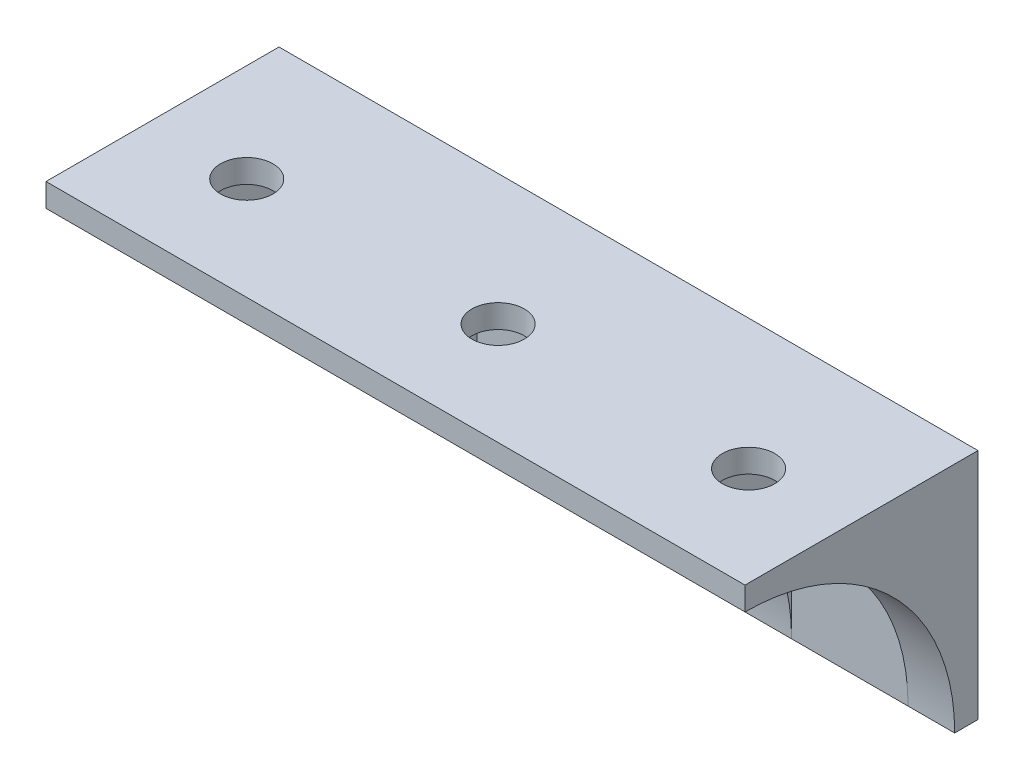
ISO-10303-21;
HEADER;
FILE_DESCRIPTION(('STEP AP214'),'2;1');
FILE_NAME('part.step','',(''),(''),'','','');
FILE_SCHEMA(('AUTOMOTIVE_DESIGN { 1 0 10303 214 1 1 1 1 }'));
ENDSEC;
DATA;
#1=APPLICATION_CONTEXT('core data for automotive mechanical design processes');
#2=APPLICATION_PROTOCOL_DEFINITION('international standard','automotive_design',2000,#1);
#3=PRODUCT_CONTEXT('',#1,'mechanical');
#4=PRODUCT('Part','Part','',(#3));
#5=PRODUCT_RELATED_PRODUCT_CATEGORY('part','',(#4));
#6=PRODUCT_DEFINITION_FORMATION('','',#4);
#7=PRODUCT_DEFINITION_CONTEXT('part definition',#1,'design');
#8=PRODUCT_DEFINITION('design','',#6,#7);
#9=PRODUCT_DEFINITION_SHAPE('','',#8);
#10=(LENGTH_UNIT() NAMED_UNIT(*) SI_UNIT(.MILLI.,.METRE.));
#11=(NAMED_UNIT(*) PLANE_ANGLE_UNIT() SI_UNIT($,.RADIAN.));
#12=(NAMED_UNIT(*) SI_UNIT($,.STERADIAN.) SOLID_ANGLE_UNIT());
#13=UNCERTAINTY_MEASURE_WITH_UNIT(LENGTH_MEASURE(1.E-05),#10,'distance_accuracy_value','');
#14=(GEOMETRIC_REPRESENTATION_CONTEXT(3) GLOBAL_UNCERTAINTY_ASSIGNED_CONTEXT((#13)) GLOBAL_UNIT_ASSIGNED_CONTEXT((#10,
#11,#12)) REPRESENTATION_CONTEXT('',''));
#15=CARTESIAN_POINT('',(0.,0.,0.));
#16=DIRECTION('',(0.,0.,1.));
#17=DIRECTION('',(1.,0.,0.));
#18=AXIS2_PLACEMENT_3D('',#15,#16,#17);
#19=CARTESIAN_POINT('',(-30.,-10.,20.));
#20=DIRECTION('',(1.,0.,0.));
#21=DIRECTION('',(0.,1.,0.));
#22=AXIS2_PLACEMENT_3D('',#19,#20,#21);
#23=CYLINDRICAL_SURFACE('',#22,18.);
#24=DIRECTION('',(1.,0.,0.));
#25=VECTOR('',#24,1.);
#26=CARTESIAN_POINT('',(-30.,-10.,2.));
#27=LINE('',#26,#25);
#28=CARTESIAN_POINT('',(-30.,-10.,2.));
#29=VERTEX_POINT('',#28);
#30=CARTESIAN_POINT('',(-26.,-10.,2.));
#31=VERTEX_POINT('',#30);
#32=EDGE_CURVE('E172',#29,#31,#27,.T.);
#33=ORIENTED_EDGE('',*,*,#32,.T.);
#34=CARTESIAN_POINT('',(-26.,-10.,20.));
#35=DIRECTION('',(-1.,0.,0.));
#36=DIRECTION('',(0.,-1.,0.));
#37=AXIS2_PLACEMENT_3D('',#34,#35,#36);
#38=CIRCLE('',#37,18.);
#39=CARTESIAN_POINT('',(-26.,8.,20.));
#40=VERTEX_POINT('',#39);
#41=EDGE_CURVE('E11',#31,#40,#38,.F.);
#42=ORIENTED_EDGE('',*,*,#41,.T.);
#43=DIRECTION('',(1.,0.,0.));
#44=VECTOR('',#43,1.);
#45=CARTESIAN_POINT('',(-30.,8.,20.));
#46=LINE('',#45,#44);
#47=CARTESIAN_POINT('',(-30.,8.,20.));
#48=VERTEX_POINT('',#47);
#49=EDGE_CURVE('E317',#48,#40,#46,.T.);
#50=ORIENTED_EDGE('',*,*,#49,.F.);
#51=CARTESIAN_POINT('',(-30.,-10.,20.));
#52=DIRECTION('',(1.,0.,0.));
#53=DIRECTION('',(0.,0.,-1.));
#54=AXIS2_PLACEMENT_3D('',#51,#52,#53);
#55=CIRCLE('',#54,18.);
#56=EDGE_CURVE('E180',#29,#48,#55,.T.);
#57=ORIENTED_EDGE('',*,*,#56,.F.);
#58=EDGE_LOOP('',(#33,#42,#50,#57));
#59=FACE_BOUND('',#58,.T.);
#60=ADVANCED_FACE('F42',(#59),#23,.F.);
#61=CARTESIAN_POINT('',(-16.,8.,20.));
#62=VERTEX_POINT('',#61);
#63=CARTESIAN_POINT('',(-11.,8.,20.));
#64=VERTEX_POINT('',#63);
#65=EDGE_CURVE('E247',#62,#64,#46,.T.);
#66=ORIENTED_EDGE('',*,*,#65,.F.);
#67=CARTESIAN_POINT('',(-16.,-10.,20.));
#68=DIRECTION('',(1.,0.,0.));
#69=DIRECTION('',(0.,0.,-1.));
#70=AXIS2_PLACEMENT_3D('',#67,#68,#69);
#71=CIRCLE('',#70,18.);
#72=CARTESIAN_POINT('',(-16.,-10.,2.));
#73=VERTEX_POINT('',#72);
#74=EDGE_CURVE('E51',#62,#73,#71,.F.);
#75=ORIENTED_EDGE('',*,*,#74,.T.);
#76=CARTESIAN_POINT('',(-11.,-10.,2.));
#77=VERTEX_POINT('',#76);
#78=EDGE_CURVE('E176',#73,#77,#27,.T.);
#79=ORIENTED_EDGE('',*,*,#78,.T.);
#80=CARTESIAN_POINT('',(-11.,-10.,20.));
#81=DIRECTION('',(-1.,0.,0.));
#82=DIRECTION('',(0.,-1.,0.));
#83=AXIS2_PLACEMENT_3D('',#80,#81,#82);
#84=CIRCLE('',#83,18.);
#85=EDGE_CURVE('E238',#77,#64,#84,.F.);
#86=ORIENTED_EDGE('',*,*,#85,.T.);
#87=EDGE_LOOP('',(#66,#75,#79,#86));
#88=FACE_BOUND('',#87,.T.);
#89=ADVANCED_FACE('F245',(#88),#23,.F.);
#90=CARTESIAN_POINT('',(11.,8.,20.));
#91=VERTEX_POINT('',#90);
#92=CARTESIAN_POINT('',(16.,8.,20.));
#93=VERTEX_POINT('',#92);
#94=EDGE_CURVE('E373',#91,#93,#46,.T.);
#95=ORIENTED_EDGE('',*,*,#94,.F.);
#96=CARTESIAN_POINT('',(11.,-10.,20.));
#97=DIRECTION('',(1.,0.,0.));
#98=DIRECTION('',(0.,1.,0.));
#99=AXIS2_PLACEMENT_3D('',#96,#97,#98);
#100=CIRCLE('',#99,18.);
#101=CARTESIAN_POINT('',(11.,-10.,2.));
#102=VERTEX_POINT('',#101);
#103=EDGE_CURVE('E234',#91,#102,#100,.F.);
#104=ORIENTED_EDGE('',*,*,#103,.T.);
#105=CARTESIAN_POINT('',(16.,-10.,2.));
#106=VERTEX_POINT('',#105);
#107=EDGE_CURVE('E190',#102,#106,#27,.T.);
#108=ORIENTED_EDGE('',*,*,#107,.T.);
#109=CARTESIAN_POINT('',(16.,-10.,20.));
#110=DIRECTION('',(-1.,0.,0.));
#111=DIRECTION('',(0.,0.,1.));
#112=AXIS2_PLACEMENT_3D('',#109,#110,#111);
#113=CIRCLE('',#112,18.);
#114=EDGE_CURVE('E230',#106,#93,#113,.F.);
#115=ORIENTED_EDGE('',*,*,#114,.T.);
#116=EDGE_LOOP('',(#95,#104,#108,#115));
#117=FACE_BOUND('',#116,.T.);
#118=ADVANCED_FACE('F355',(#117),#23,.F.);
#119=CARTESIAN_POINT('',(30.,10.,2.));
#120=DIRECTION('',(-1.,0.,0.));
#121=DIRECTION('',(0.,-1.,0.));
#122=AXIS2_PLACEMENT_3D('',#119,#120,#121);
#123=PLANE('',#122);
#124=DIRECTION('',(0.,1.,0.));
#125=VECTOR('',#124,1.);
#126=CARTESIAN_POINT('',(30.,10.,0.));
#127=LINE('',#126,#125);
#128=CARTESIAN_POINT('',(30.,-10.,0.));
#129=VERTEX_POINT('',#128);
#130=CARTESIAN_POINT('',(30.,10.,0.));
#131=VERTEX_POINT('',#130);
#132=EDGE_CURVE('E326',#129,#131,#127,.T.);
#133=ORIENTED_EDGE('',*,*,#132,.T.);
#134=DIRECTION('',(0.,0.,-1.));
#135=VECTOR('',#134,1.);
#136=CARTESIAN_POINT('',(30.,10.,2.));
#137=LINE('',#136,#135);
#138=CARTESIAN_POINT('',(30.,10.,20.));
#139=VERTEX_POINT('',#138);
#140=EDGE_CURVE('E218',#139,#131,#137,.T.);
#141=ORIENTED_EDGE('',*,*,#140,.F.);
#142=DIRECTION('',(0.,1.,0.));
#143=VECTOR('',#142,1.);
#144=CARTESIAN_POINT('',(30.,10.,20.));
#145=LINE('',#144,#143);
#146=CARTESIAN_POINT('',(30.,8.,20.));
#147=VERTEX_POINT('',#146);
#148=EDGE_CURVE('E320',#147,#139,#145,.T.);
#149=ORIENTED_EDGE('',*,*,#148,.F.);
#150=CARTESIAN_POINT('',(30.,-10.,20.));
#151=DIRECTION('',(-1.,0.,0.));
#152=DIRECTION('',(0.,-1.,0.));
#153=AXIS2_PLACEMENT_3D('',#150,#151,#152);
#154=CIRCLE('',#153,18.);
#155=CARTESIAN_POINT('',(30.,-10.,2.));
#156=VERTEX_POINT('',#155);
#157=EDGE_CURVE('E222',#147,#156,#154,.T.);
#158=ORIENTED_EDGE('',*,*,#157,.T.);
#159=DIRECTION('',(0.,0.,-1.));
#160=VECTOR('',#159,1.);
#161=CARTESIAN_POINT('',(30.,-10.,2.));
#162=LINE('',#161,#160);
#163=EDGE_CURVE('E182',#156,#129,#162,.T.);
#164=ORIENTED_EDGE('',*,*,#163,.T.);
#165=EDGE_LOOP('',(#133,#141,#149,#158,#164));
#166=FACE_BOUND('',#165,.T.);
#167=ADVANCED_FACE('F366',(#166),#123,.F.);
#168=CARTESIAN_POINT('',(-30.,10.,2.));
#169=DIRECTION('',(0.,-1.,0.));
#170=DIRECTION('',(0.,0.,-1.));
#171=AXIS2_PLACEMENT_3D('',#168,#169,#170);
#172=PLANE('',#171);
#173=CARTESIAN_POINT('',(21.4986885576466,10.,11.1912741614558));
#174=DIRECTION('',(0.,-1.,0.));
#175=DIRECTION('',(0.,0.,-1.));
#176=AXIS2_PLACEMENT_3D('',#173,#174,#175);
#177=CIRCLE('',#176,2.25);
#178=CARTESIAN_POINT('',(21.4986885576466,10.,8.9412741614558));
#179=VERTEX_POINT('',#178);
#180=EDGE_CURVE('E450',#179,#179,#177,.T.);
#181=ORIENTED_EDGE('',*,*,#180,.T.);
#182=EDGE_LOOP('',(#181));
#183=FACE_BOUND('',#182,.T.);
#184=CARTESIAN_POINT('',(-21.5793316978392,10.,11.1912741614558));
#185=DIRECTION('',(0.,-1.,0.));
#186=DIRECTION('',(0.,0.,-1.));
#187=AXIS2_PLACEMENT_3D('',#184,#185,#186);
#188=CIRCLE('',#187,2.25);
#189=CARTESIAN_POINT('',(-21.5793316978392,10.,8.9412741614558));
#190=VERTEX_POINT('',#189);
#191=EDGE_CURVE('E463',#190,#190,#188,.T.);
#192=ORIENTED_EDGE('',*,*,#191,.T.);
#193=EDGE_LOOP('',(#192));
#194=FACE_BOUND('',#193,.T.);
#195=CARTESIAN_POINT('',(0.,10.,11.1912741614558));
#196=DIRECTION('',(0.,-1.,0.));
#197=DIRECTION('',(0.,0.,-1.));
#198=AXIS2_PLACEMENT_3D('',#195,#196,#197);
#199=CIRCLE('',#198,2.25);
#200=CARTESIAN_POINT('',(0.,10.,8.9412741614558));
#201=VERTEX_POINT('',#200);
#202=EDGE_CURVE('E295',#201,#201,#199,.T.);
#203=ORIENTED_EDGE('',*,*,#202,.T.);
#204=EDGE_LOOP('',(#203));
#205=FACE_BOUND('',#204,.T.);
#206=DIRECTION('',(-1.,0.,0.));
#207=VECTOR('',#206,1.);
#208=CARTESIAN_POINT('',(-30.,10.,0.));
#209=LINE('',#208,#207);
#210=CARTESIAN_POINT('',(-30.,10.,0.));
#211=VERTEX_POINT('',#210);
#212=EDGE_CURVE('E208',#131,#211,#209,.T.);
#213=ORIENTED_EDGE('',*,*,#212,.T.);
#214=DIRECTION('',(0.,0.,-1.));
#215=VECTOR('',#214,1.);
#216=CARTESIAN_POINT('',(-30.,10.,2.));
#217=LINE('',#216,#215);
#218=CARTESIAN_POINT('',(-30.,10.,20.));
#219=VERTEX_POINT('',#218);
#220=EDGE_CURVE('E214',#219,#211,#217,.T.);
#221=ORIENTED_EDGE('',*,*,#220,.F.);
#222=DIRECTION('',(-1.,0.,0.));
#223=VECTOR('',#222,1.);
#224=CARTESIAN_POINT('',(-30.,10.,20.));
#225=LINE('',#224,#223);
#226=EDGE_CURVE('E323',#139,#219,#225,.T.);
#227=ORIENTED_EDGE('',*,*,#226,.F.);
#228=ORIENTED_EDGE('',*,*,#140,.T.);
#229=EDGE_LOOP('',(#213,#221,#227,#228));
#230=FACE_BOUND('',#229,.T.);
#231=ADVANCED_FACE('F336',(#183,#194,#205,#230),#172,.F.);
#232=CARTESIAN_POINT('',(-30.,10.,2.));
#233=DIRECTION('',(1.,0.,0.));
#234=DIRECTION('',(0.,0.,-1.));
#235=AXIS2_PLACEMENT_3D('',#232,#233,#234);
#236=PLANE('',#235);
#237=DIRECTION('',(0.,-1.,0.));
#238=VECTOR('',#237,1.);
#239=CARTESIAN_POINT('',(-30.,10.,0.));
#240=LINE('',#239,#238);
#241=CARTESIAN_POINT('',(-30.,-10.,0.));
#242=VERTEX_POINT('',#241);
#243=EDGE_CURVE('E203',#211,#242,#240,.T.);
#244=ORIENTED_EDGE('',*,*,#243,.T.);
#245=DIRECTION('',(0.,0.,-1.));
#246=VECTOR('',#245,1.);
#247=CARTESIAN_POINT('',(-30.,-10.,2.));
#248=LINE('',#247,#246);
#249=EDGE_CURVE('E188',#29,#242,#248,.T.);
#250=ORIENTED_EDGE('',*,*,#249,.F.);
#251=ORIENTED_EDGE('',*,*,#56,.T.);
#252=DIRECTION('',(0.,-1.,0.));
#253=VECTOR('',#252,1.);
#254=CARTESIAN_POINT('',(-30.,10.,20.));
#255=LINE('',#254,#253);
#256=EDGE_CURVE('E262',#219,#48,#255,.T.);
#257=ORIENTED_EDGE('',*,*,#256,.F.);
#258=ORIENTED_EDGE('',*,*,#220,.T.);
#259=EDGE_LOOP('',(#244,#250,#251,#257,#258));
#260=FACE_BOUND('',#259,.T.);
#261=ADVANCED_FACE('F340',(#260),#236,.F.);
#262=CARTESIAN_POINT('',(-30.,-10.,2.));
#263=DIRECTION('',(0.,1.,0.));
#264=DIRECTION('',(0.,0.,1.));
#265=AXIS2_PLACEMENT_3D('',#262,#263,#264);
#266=PLANE('',#265);
#267=DIRECTION('',(1.,0.,0.));
#268=VECTOR('',#267,1.);
#269=CARTESIAN_POINT('',(-30.,-10.,0.));
#270=LINE('',#269,#268);
#271=EDGE_CURVE('E194',#242,#129,#270,.T.);
#272=ORIENTED_EDGE('',*,*,#271,.T.);
#273=ORIENTED_EDGE('',*,*,#163,.F.);
#274=CARTESIAN_POINT('',(26.,-10.,2.));
#275=VERTEX_POINT('',#274);
#276=EDGE_CURVE('E184',#275,#156,#27,.T.);
#277=ORIENTED_EDGE('',*,*,#276,.F.);
#278=DIRECTION('',(1.,0.,0.));
#279=VECTOR('',#278,1.);
#280=CARTESIAN_POINT('',(16.,-10.,2.));
#281=LINE('',#280,#279);
#282=EDGE_CURVE('E306',#106,#275,#281,.T.);
#283=ORIENTED_EDGE('',*,*,#282,.F.);
#284=ORIENTED_EDGE('',*,*,#107,.F.);
#285=DIRECTION('',(1.,0.,0.));
#286=VECTOR('',#285,1.);
#287=CARTESIAN_POINT('',(-11.,-10.,2.));
#288=LINE('',#287,#286);
#289=EDGE_CURVE('E282',#77,#102,#288,.T.);
#290=ORIENTED_EDGE('',*,*,#289,.F.);
#291=ORIENTED_EDGE('',*,*,#78,.F.);
#292=DIRECTION('',(1.,0.,0.));
#293=VECTOR('',#292,1.);
#294=CARTESIAN_POINT('',(-26.,-10.,2.));
#295=LINE('',#294,#293);
#296=EDGE_CURVE('E160',#31,#73,#295,.T.);
#297=ORIENTED_EDGE('',*,*,#296,.F.);
#298=ORIENTED_EDGE('',*,*,#32,.F.);
#299=ORIENTED_EDGE('',*,*,#249,.T.);
#300=EDGE_LOOP('',(#272,#273,#277,#283,#284,#290,#291,#297,#298,#299));
#301=FACE_BOUND('',#300,.T.);
#302=ADVANCED_FACE('F170',(#301),#266,.F.);
#303=CARTESIAN_POINT('',(0.,0.,0.));
#304=DIRECTION('',(0.,0.,1.));
#305=DIRECTION('',(1.,0.,0.));
#306=AXIS2_PLACEMENT_3D('',#303,#304,#305);
#307=PLANE('',#306);
#308=ORIENTED_EDGE('',*,*,#132,.F.);
#309=ORIENTED_EDGE('',*,*,#271,.F.);
#310=ORIENTED_EDGE('',*,*,#243,.F.);
#311=ORIENTED_EDGE('',*,*,#212,.F.);
#312=EDGE_LOOP('',(#308,#309,#310,#311));
#313=FACE_BOUND('',#312,.T.);
#314=ADVANCED_FACE('F341',(#313),#307,.F.);
#315=CARTESIAN_POINT('',(0.,0.,20.));
#316=DIRECTION('',(0.,0.,1.));
#317=DIRECTION('',(1.,0.,0.));
#318=AXIS2_PLACEMENT_3D('',#315,#316,#317);
#319=PLANE('',#318);
#320=ORIENTED_EDGE('',*,*,#256,.T.);
#321=ORIENTED_EDGE('',*,*,#49,.T.);
#322=DIRECTION('',(-1.,0.,0.));
#323=VECTOR('',#322,1.);
#324=CARTESIAN_POINT('',(-26.,8.,20.));
#325=LINE('',#324,#323);
#326=EDGE_CURVE('E165',#62,#40,#325,.T.);
#327=ORIENTED_EDGE('',*,*,#326,.F.);
#328=ORIENTED_EDGE('',*,*,#65,.T.);
#329=DIRECTION('',(-1.,0.,0.));
#330=VECTOR('',#329,1.);
#331=CARTESIAN_POINT('',(-11.,8.,20.));
#332=LINE('',#331,#330);
#333=EDGE_CURVE('E259',#91,#64,#332,.T.);
#334=ORIENTED_EDGE('',*,*,#333,.F.);
#335=ORIENTED_EDGE('',*,*,#94,.T.);
#336=DIRECTION('',(-1.,0.,0.));
#337=VECTOR('',#336,1.);
#338=CARTESIAN_POINT('',(16.,8.,20.));
#339=LINE('',#338,#337);
#340=CARTESIAN_POINT('',(26.,8.,20.));
#341=VERTEX_POINT('',#340);
#342=EDGE_CURVE('E271',#341,#93,#339,.T.);
#343=ORIENTED_EDGE('',*,*,#342,.F.);
#344=EDGE_CURVE('E316',#341,#147,#46,.T.);
#345=ORIENTED_EDGE('',*,*,#344,.T.);
#346=ORIENTED_EDGE('',*,*,#148,.T.);
#347=ORIENTED_EDGE('',*,*,#226,.T.);
#348=EDGE_LOOP('',(#320,#321,#327,#328,#334,#335,#343,#345,#346,#347));
#349=FACE_BOUND('',#348,.T.);
#350=ADVANCED_FACE('F343',(#349),#319,.T.);
#351=ORIENTED_EDGE('',*,*,#344,.F.);
#352=CARTESIAN_POINT('',(26.,-10.,20.));
#353=DIRECTION('',(1.,0.,0.));
#354=DIRECTION('',(0.,1.,0.));
#355=AXIS2_PLACEMENT_3D('',#352,#353,#354);
#356=CIRCLE('',#355,18.);
#357=EDGE_CURVE('E227',#341,#275,#356,.F.);
#358=ORIENTED_EDGE('',*,*,#357,.T.);
#359=ORIENTED_EDGE('',*,*,#276,.T.);
#360=ORIENTED_EDGE('',*,*,#157,.F.);
#361=EDGE_LOOP('',(#351,#358,#359,#360));
#362=FACE_BOUND('',#361,.T.);
#363=ADVANCED_FACE('F44',(#362),#23,.F.);
#364=CARTESIAN_POINT('',(16.,8.,2.));
#365=DIRECTION('',(-1.,0.,0.));
#366=DIRECTION('',(0.,0.,1.));
#367=AXIS2_PLACEMENT_3D('',#364,#365,#366);
#368=PLANE('',#367);
#369=DIRECTION('',(0.,-1.,0.));
#370=VECTOR('',#369,1.);
#371=CARTESIAN_POINT('',(16.,8.,2.));
#372=LINE('',#371,#370);
#373=CARTESIAN_POINT('',(16.,8.,2.));
#374=VERTEX_POINT('',#373);
#375=EDGE_CURVE('E298',#374,#106,#372,.T.);
#376=ORIENTED_EDGE('',*,*,#375,.F.);
#377=DIRECTION('',(0.,0.,1.));
#378=VECTOR('',#377,1.);
#379=CARTESIAN_POINT('',(16.,8.,2.));
#380=LINE('',#379,#378);
#381=EDGE_CURVE('E292',#374,#93,#380,.T.);
#382=ORIENTED_EDGE('',*,*,#381,.T.);
#383=ORIENTED_EDGE('',*,*,#114,.F.);
#384=EDGE_LOOP('',(#376,#382,#383));
#385=FACE_BOUND('',#384,.T.);
#386=ADVANCED_FACE('F357',(#385),#368,.F.);
#387=CARTESIAN_POINT('',(26.,8.,2.));
#388=DIRECTION('',(1.,0.,0.));
#389=DIRECTION('',(0.,1.,0.));
#390=AXIS2_PLACEMENT_3D('',#387,#388,#389);
#391=PLANE('',#390);
#392=DIRECTION('',(0.,0.,1.));
#393=VECTOR('',#392,1.);
#394=CARTESIAN_POINT('',(26.,8.,2.));
#395=LINE('',#394,#393);
#396=CARTESIAN_POINT('',(26.,8.,2.));
#397=VERTEX_POINT('',#396);
#398=EDGE_CURVE('E58',#397,#341,#395,.T.);
#399=ORIENTED_EDGE('',*,*,#398,.F.);
#400=DIRECTION('',(0.,1.,0.));
#401=VECTOR('',#400,1.);
#402=CARTESIAN_POINT('',(26.,8.,2.));
#403=LINE('',#402,#401);
#404=EDGE_CURVE('E302',#275,#397,#403,.T.);
#405=ORIENTED_EDGE('',*,*,#404,.F.);
#406=ORIENTED_EDGE('',*,*,#357,.F.);
#407=EDGE_LOOP('',(#399,#405,#406));
#408=FACE_BOUND('',#407,.T.);
#409=ADVANCED_FACE('F361',(#408),#391,.F.);
#410=CARTESIAN_POINT('',(16.,8.,2.));
#411=DIRECTION('',(0.,1.,0.));
#412=DIRECTION('',(0.,0.,1.));
#413=AXIS2_PLACEMENT_3D('',#410,#411,#412);
#414=PLANE('',#413);
#415=CARTESIAN_POINT('',(21.4986885576466,7.99999999999999,11.1912741614558));
#416=DIRECTION('',(0.,-1.,0.));
#417=DIRECTION('',(0.,0.,-1.));
#418=AXIS2_PLACEMENT_3D('',#415,#416,#417);
#419=CIRCLE('',#418,2.24999999999999);
#420=CARTESIAN_POINT('',(21.4986885576466,7.99999999999999,8.94127416145581));
#421=VERTEX_POINT('',#420);
#422=EDGE_CURVE('E453',#421,#421,#419,.T.);
#423=ORIENTED_EDGE('',*,*,#422,.F.);
#424=EDGE_LOOP('',(#423));
#425=FACE_BOUND('',#424,.T.);
#426=ORIENTED_EDGE('',*,*,#342,.T.);
#427=ORIENTED_EDGE('',*,*,#381,.F.);
#428=DIRECTION('',(-1.,0.,0.));
#429=VECTOR('',#428,1.);
#430=CARTESIAN_POINT('',(16.,8.,2.));
#431=LINE('',#430,#429);
#432=EDGE_CURVE('E291',#397,#374,#431,.T.);
#433=ORIENTED_EDGE('',*,*,#432,.F.);
#434=ORIENTED_EDGE('',*,*,#398,.T.);
#435=EDGE_LOOP('',(#426,#427,#433,#434));
#436=FACE_BOUND('',#435,.T.);
#437=ADVANCED_FACE('F390',(#425,#436),#414,.F.);
#438=CARTESIAN_POINT('',(0.,0.,2.));
#439=DIRECTION('',(0.,0.,1.));
#440=DIRECTION('',(1.,0.,0.));
#441=AXIS2_PLACEMENT_3D('',#438,#439,#440);
#442=PLANE('',#441);
#443=ORIENTED_EDGE('',*,*,#375,.T.);
#444=ORIENTED_EDGE('',*,*,#282,.T.);
#445=ORIENTED_EDGE('',*,*,#404,.T.);
#446=ORIENTED_EDGE('',*,*,#432,.T.);
#447=EDGE_LOOP('',(#443,#444,#445,#446));
#448=FACE_BOUND('',#447,.T.);
#449=ADVANCED_FACE('F386',(#448),#442,.T.);
#450=CARTESIAN_POINT('',(-11.,8.,2.));
#451=DIRECTION('',(-1.,0.,0.));
#452=DIRECTION('',(0.,-1.,0.));
#453=AXIS2_PLACEMENT_3D('',#450,#451,#452);
#454=PLANE('',#453);
#455=DIRECTION('',(0.,-1.,0.));
#456=VECTOR('',#455,1.);
#457=CARTESIAN_POINT('',(-11.,8.,2.));
#458=LINE('',#457,#456);
#459=CARTESIAN_POINT('',(-11.,8.,2.));
#460=VERTEX_POINT('',#459);
#461=EDGE_CURVE('E274',#460,#77,#458,.T.);
#462=ORIENTED_EDGE('',*,*,#461,.F.);
#463=DIRECTION('',(0.,0.,1.));
#464=VECTOR('',#463,1.);
#465=CARTESIAN_POINT('',(-11.,8.,2.));
#466=LINE('',#465,#464);
#467=EDGE_CURVE('E268',#460,#64,#466,.T.);
#468=ORIENTED_EDGE('',*,*,#467,.T.);
#469=ORIENTED_EDGE('',*,*,#85,.F.);
#470=EDGE_LOOP('',(#462,#468,#469));
#471=FACE_BOUND('',#470,.T.);
#472=ADVANCED_FACE('F381',(#471),#454,.F.);
#473=CARTESIAN_POINT('',(11.,8.,2.));
#474=DIRECTION('',(1.,0.,0.));
#475=DIRECTION('',(0.,1.,0.));
#476=AXIS2_PLACEMENT_3D('',#473,#474,#475);
#477=PLANE('',#476);
#478=DIRECTION('',(0.,0.,1.));
#479=VECTOR('',#478,1.);
#480=CARTESIAN_POINT('',(11.,8.,2.));
#481=LINE('',#480,#479);
#482=CARTESIAN_POINT('',(11.,8.,2.));
#483=VERTEX_POINT('',#482);
#484=EDGE_CURVE('E66',#483,#91,#481,.T.);
#485=ORIENTED_EDGE('',*,*,#484,.F.);
#486=DIRECTION('',(0.,1.,0.));
#487=VECTOR('',#486,1.);
#488=CARTESIAN_POINT('',(11.,8.,2.));
#489=LINE('',#488,#487);
#490=EDGE_CURVE('E278',#102,#483,#489,.T.);
#491=ORIENTED_EDGE('',*,*,#490,.F.);
#492=ORIENTED_EDGE('',*,*,#103,.F.);
#493=EDGE_LOOP('',(#485,#491,#492));
#494=FACE_BOUND('',#493,.T.);
#495=ADVANCED_FACE('F404',(#494),#477,.F.);
#496=CARTESIAN_POINT('',(-11.,8.,2.));
#497=DIRECTION('',(0.,1.,0.));
#498=DIRECTION('',(0.,0.,1.));
#499=AXIS2_PLACEMENT_3D('',#496,#497,#498);
#500=PLANE('',#499);
#501=CARTESIAN_POINT('',(0.,7.99999999999999,11.1912741614558));
#502=DIRECTION('',(0.,-1.,0.));
#503=DIRECTION('',(0.,0.,-1.));
#504=AXIS2_PLACEMENT_3D('',#501,#502,#503);
#505=CIRCLE('',#504,2.24999999999999);
#506=CARTESIAN_POINT('',(0.,7.99999999999999,8.94127416145581));
#507=VERTEX_POINT('',#506);
#508=EDGE_CURVE('E467',#507,#507,#505,.T.);
#509=ORIENTED_EDGE('',*,*,#508,.F.);
#510=EDGE_LOOP('',(#509));
#511=FACE_BOUND('',#510,.T.);
#512=ORIENTED_EDGE('',*,*,#333,.T.);
#513=ORIENTED_EDGE('',*,*,#467,.F.);
#514=DIRECTION('',(-1.,0.,0.));
#515=VECTOR('',#514,1.);
#516=CARTESIAN_POINT('',(-11.,8.,2.));
#517=LINE('',#516,#515);
#518=EDGE_CURVE('E267',#483,#460,#517,.T.);
#519=ORIENTED_EDGE('',*,*,#518,.F.);
#520=ORIENTED_EDGE('',*,*,#484,.T.);
#521=EDGE_LOOP('',(#512,#513,#519,#520));
#522=FACE_BOUND('',#521,.T.);
#523=ADVANCED_FACE('F378',(#511,#522),#500,.F.);
#524=CARTESIAN_POINT('',(0.,0.,2.));
#525=DIRECTION('',(0.,0.,1.));
#526=DIRECTION('',(1.,0.,0.));
#527=AXIS2_PLACEMENT_3D('',#524,#525,#526);
#528=PLANE('',#527);
#529=ORIENTED_EDGE('',*,*,#461,.T.);
#530=ORIENTED_EDGE('',*,*,#289,.T.);
#531=ORIENTED_EDGE('',*,*,#490,.T.);
#532=ORIENTED_EDGE('',*,*,#518,.T.);
#533=EDGE_LOOP('',(#529,#530,#531,#532));
#534=FACE_BOUND('',#533,.T.);
#535=ADVANCED_FACE('F383',(#534),#528,.T.);
#536=CARTESIAN_POINT('',(-26.,8.,2.));
#537=DIRECTION('',(-1.,0.,0.));
#538=DIRECTION('',(0.,-1.,0.));
#539=AXIS2_PLACEMENT_3D('',#536,#537,#538);
#540=PLANE('',#539);
#541=DIRECTION('',(0.,-1.,0.));
#542=VECTOR('',#541,1.);
#543=CARTESIAN_POINT('',(-26.,8.,2.));
#544=LINE('',#543,#542);
#545=CARTESIAN_POINT('',(-26.,8.,2.));
#546=VERTEX_POINT('',#545);
#547=EDGE_CURVE('E147',#546,#31,#544,.T.);
#548=ORIENTED_EDGE('',*,*,#547,.F.);
#549=DIRECTION('',(0.,0.,1.));
#550=VECTOR('',#549,1.);
#551=CARTESIAN_POINT('',(-26.,8.,2.));
#552=LINE('',#551,#550);
#553=EDGE_CURVE('E149',#546,#40,#552,.T.);
#554=ORIENTED_EDGE('',*,*,#553,.T.);
#555=ORIENTED_EDGE('',*,*,#41,.F.);
#556=EDGE_LOOP('',(#548,#554,#555));
#557=FACE_BOUND('',#556,.T.);
#558=ADVANCED_FACE('F146',(#557),#540,.F.);
#559=CARTESIAN_POINT('',(-16.,8.,2.));
#560=DIRECTION('',(1.,0.,0.));
#561=DIRECTION('',(0.,0.,-1.));
#562=AXIS2_PLACEMENT_3D('',#559,#560,#561);
#563=PLANE('',#562);
#564=DIRECTION('',(0.,0.,1.));
#565=VECTOR('',#564,1.);
#566=CARTESIAN_POINT('',(-16.,8.,2.));
#567=LINE('',#566,#565);
#568=CARTESIAN_POINT('',(-16.,8.,2.));
#569=VERTEX_POINT('',#568);
#570=EDGE_CURVE('E251',#569,#62,#567,.T.);
#571=ORIENTED_EDGE('',*,*,#570,.F.);
#572=DIRECTION('',(0.,1.,0.));
#573=VECTOR('',#572,1.);
#574=CARTESIAN_POINT('',(-16.,8.,2.));
#575=LINE('',#574,#573);
#576=EDGE_CURVE('E178',#73,#569,#575,.T.);
#577=ORIENTED_EDGE('',*,*,#576,.F.);
#578=ORIENTED_EDGE('',*,*,#74,.F.);
#579=EDGE_LOOP('',(#571,#577,#578));
#580=FACE_BOUND('',#579,.T.);
#581=ADVANCED_FACE('F250',(#580),#563,.F.);
#582=CARTESIAN_POINT('',(-26.,8.,2.));
#583=DIRECTION('',(0.,1.,0.));
#584=DIRECTION('',(0.,0.,1.));
#585=AXIS2_PLACEMENT_3D('',#582,#583,#584);
#586=PLANE('',#585);
#587=CARTESIAN_POINT('',(-21.5793316978392,7.99999999999999,11.1912741614558));
#588=DIRECTION('',(0.,-1.,0.));
#589=DIRECTION('',(0.,0.,-1.));
#590=AXIS2_PLACEMENT_3D('',#587,#588,#589);
#591=CIRCLE('',#590,2.24999999999999);
#592=CARTESIAN_POINT('',(-21.5793316978392,7.99999999999999,8.94127416145581));
#593=VERTEX_POINT('',#592);
#594=EDGE_CURVE('E457',#593,#593,#591,.T.);
#595=ORIENTED_EDGE('',*,*,#594,.F.);
#596=EDGE_LOOP('',(#595));
#597=FACE_BOUND('',#596,.T.);
#598=ORIENTED_EDGE('',*,*,#326,.T.);
#599=ORIENTED_EDGE('',*,*,#553,.F.);
#600=DIRECTION('',(-1.,0.,0.));
#601=VECTOR('',#600,1.);
#602=CARTESIAN_POINT('',(-26.,8.,2.));
#603=LINE('',#602,#601);
#604=EDGE_CURVE('E163',#569,#546,#603,.T.);
#605=ORIENTED_EDGE('',*,*,#604,.F.);
#606=ORIENTED_EDGE('',*,*,#570,.T.);
#607=EDGE_LOOP('',(#598,#599,#605,#606));
#608=FACE_BOUND('',#607,.T.);
#609=ADVANCED_FACE('F424',(#597,#608),#586,.F.);
#610=CARTESIAN_POINT('',(0.,0.,2.));
#611=DIRECTION('',(0.,0.,1.));
#612=DIRECTION('',(1.,0.,0.));
#613=AXIS2_PLACEMENT_3D('',#610,#611,#612);
#614=PLANE('',#613);
#615=ORIENTED_EDGE('',*,*,#547,.T.);
#616=ORIENTED_EDGE('',*,*,#296,.T.);
#617=ORIENTED_EDGE('',*,*,#576,.T.);
#618=ORIENTED_EDGE('',*,*,#604,.T.);
#619=EDGE_LOOP('',(#615,#616,#617,#618));
#620=FACE_BOUND('',#619,.T.);
#621=ADVANCED_FACE('F158',(#620),#614,.T.);
#622=CARTESIAN_POINT('',(0.,8.,11.1912741614558));
#623=DIRECTION('',(0.,-1.,0.));
#624=DIRECTION('',(0.,0.,-1.));
#625=AXIS2_PLACEMENT_3D('',#622,#623,#624);
#626=CYLINDRICAL_SURFACE('',#625,2.24999999999999);
#627=ORIENTED_EDGE('',*,*,#202,.F.);
#628=EDGE_LOOP('',(#627));
#629=FACE_BOUND('',#628,.T.);
#630=ORIENTED_EDGE('',*,*,#508,.T.);
#631=EDGE_LOOP('',(#630));
#632=FACE_BOUND('',#631,.T.);
#633=ADVANCED_FACE('F434',(#629,#632),#626,.F.);
#634=CARTESIAN_POINT('',(-21.5793316978392,8.,11.1912741614558));
#635=DIRECTION('',(0.,-1.,0.));
#636=DIRECTION('',(0.,0.,-1.));
#637=AXIS2_PLACEMENT_3D('',#634,#635,#636);
#638=CYLINDRICAL_SURFACE('',#637,2.24999999999999);
#639=ORIENTED_EDGE('',*,*,#191,.F.);
#640=EDGE_LOOP('',(#639));
#641=FACE_BOUND('',#640,.T.);
#642=ORIENTED_EDGE('',*,*,#594,.T.);
#643=EDGE_LOOP('',(#642));
#644=FACE_BOUND('',#643,.T.);
#645=ADVANCED_FACE('F437',(#641,#644),#638,.F.);
#646=CARTESIAN_POINT('',(21.4986885576466,8.,11.1912741614558));
#647=DIRECTION('',(0.,-1.,0.));
#648=DIRECTION('',(0.,0.,-1.));
#649=AXIS2_PLACEMENT_3D('',#646,#647,#648);
#650=CYLINDRICAL_SURFACE('',#649,2.24999999999999);
#651=ORIENTED_EDGE('',*,*,#180,.F.);
#652=EDGE_LOOP('',(#651));
#653=FACE_BOUND('',#652,.T.);
#654=ORIENTED_EDGE('',*,*,#422,.T.);
#655=EDGE_LOOP('',(#654));
#656=FACE_BOUND('',#655,.T.);
#657=ADVANCED_FACE('F441',(#653,#656),#650,.F.);
#658=CLOSED_SHELL('',(#60,#89,#118,#167,#231,#261,#302,#314,#350,#363,#386,#409,#437,#449,#472,
#495,#523,#535,#558,#581,#609,#621,#633,#645,#657));
#659=MANIFOLD_SOLID_BREP('B2',#658);
#660=ADVANCED_BREP_SHAPE_REPRESENTATION('',(#18,#659),#14);
#661=SHAPE_DEFINITION_REPRESENTATION(#9,#660);
ENDSEC;
END-ISO-10303-21;
